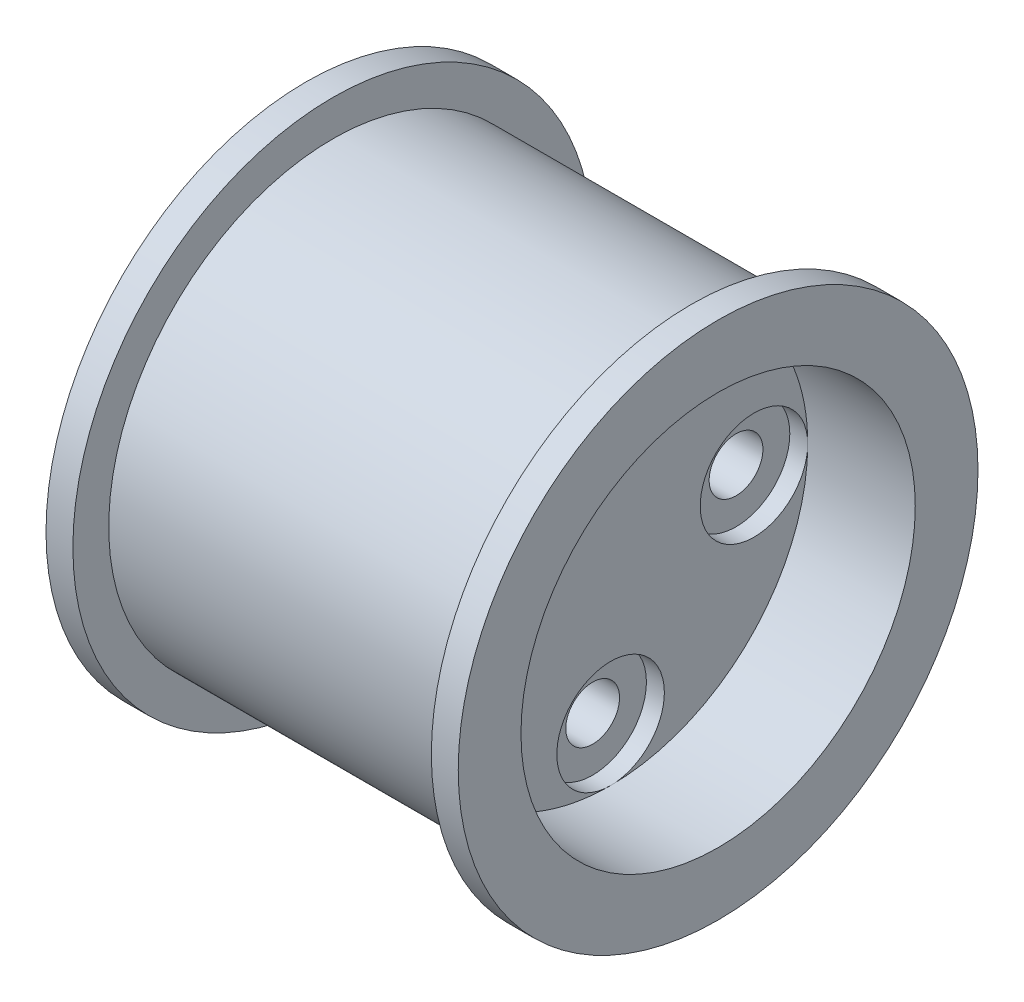
ISO-10303-21;
HEADER;
FILE_DESCRIPTION(('STEP AP214'),'2;1');
FILE_NAME('part.step','',(''),(''),'','','');
FILE_SCHEMA(('AUTOMOTIVE_DESIGN { 1 0 10303 214 1 1 1 1 }'));
ENDSEC;
DATA;
#1=APPLICATION_CONTEXT('core data for automotive mechanical design processes');
#2=APPLICATION_PROTOCOL_DEFINITION('international standard','automotive_design',2000,#1);
#3=PRODUCT_CONTEXT('',#1,'mechanical');
#4=PRODUCT('Part','Part','',(#3));
#5=PRODUCT_RELATED_PRODUCT_CATEGORY('part','',(#4));
#6=PRODUCT_DEFINITION_FORMATION('','',#4);
#7=PRODUCT_DEFINITION_CONTEXT('part definition',#1,'design');
#8=PRODUCT_DEFINITION('design','',#6,#7);
#9=PRODUCT_DEFINITION_SHAPE('','',#8);
#10=(LENGTH_UNIT() NAMED_UNIT(*) SI_UNIT(.MILLI.,.METRE.));
#11=(NAMED_UNIT(*) PLANE_ANGLE_UNIT() SI_UNIT($,.RADIAN.));
#12=(NAMED_UNIT(*) SI_UNIT($,.STERADIAN.) SOLID_ANGLE_UNIT());
#13=UNCERTAINTY_MEASURE_WITH_UNIT(LENGTH_MEASURE(1.E-05),#10,'distance_accuracy_value','');
#14=(GEOMETRIC_REPRESENTATION_CONTEXT(3) GLOBAL_UNCERTAINTY_ASSIGNED_CONTEXT((#13)) GLOBAL_UNIT_ASSIGNED_CONTEXT((#10,
#11,#12)) REPRESENTATION_CONTEXT('',''));
#15=CARTESIAN_POINT('',(0.,0.,0.));
#16=DIRECTION('',(0.,0.,1.));
#17=DIRECTION('',(1.,0.,0.));
#18=AXIS2_PLACEMENT_3D('',#15,#16,#17);
#19=CARTESIAN_POINT('',(-4.24264068711928,0.,8.));
#20=DIRECTION('',(1.,0.,0.));
#21=DIRECTION('',(0.,0.,-1.));
#22=AXIS2_PLACEMENT_3D('',#19,#20,#21);
#23=CYLINDRICAL_SURFACE('',#22,1.5);
#24=CARTESIAN_POINT('',(0.,0.,8.));
#25=DIRECTION('',(1.,0.,0.));
#26=DIRECTION('',(0.,0.,-1.));
#27=AXIS2_PLACEMENT_3D('',#24,#25,#26);
#28=CIRCLE('',#27,1.5);
#29=CARTESIAN_POINT('',(0.,0.,6.5));
#30=VERTEX_POINT('',#29);
#31=EDGE_CURVE('E116',#30,#30,#28,.F.);
#32=ORIENTED_EDGE('',*,*,#31,.T.);
#33=EDGE_LOOP('',(#32));
#34=FACE_BOUND('',#33,.T.);
#35=CARTESIAN_POINT('',(16.,0.,8.));
#36=DIRECTION('',(1.,0.,0.));
#37=DIRECTION('',(0.,0.,-1.));
#38=AXIS2_PLACEMENT_3D('',#35,#36,#37);
#39=CIRCLE('',#38,1.5);
#40=CARTESIAN_POINT('',(16.,0.,6.5));
#41=VERTEX_POINT('',#40);
#42=EDGE_CURVE('E49',#41,#41,#39,.F.);
#43=ORIENTED_EDGE('',*,*,#42,.F.);
#44=EDGE_LOOP('',(#43));
#45=FACE_BOUND('',#44,.T.);
#46=ADVANCED_FACE('F45',(#34,#45),#23,.F.);
#47=CARTESIAN_POINT('',(-4.24264068711928,-8.,0.));
#48=DIRECTION('',(1.,0.,0.));
#49=DIRECTION('',(0.,0.,-1.));
#50=AXIS2_PLACEMENT_3D('',#47,#48,#49);
#51=CYLINDRICAL_SURFACE('',#50,1.5);
#52=CARTESIAN_POINT('',(0.,-8.,0.));
#53=DIRECTION('',(1.,0.,0.));
#54=DIRECTION('',(0.,0.,-1.));
#55=AXIS2_PLACEMENT_3D('',#52,#53,#54);
#56=CIRCLE('',#55,1.5);
#57=CARTESIAN_POINT('',(0.,-8.,-1.5));
#58=VERTEX_POINT('',#57);
#59=EDGE_CURVE('E112',#58,#58,#56,.F.);
#60=ORIENTED_EDGE('',*,*,#59,.T.);
#61=EDGE_LOOP('',(#60));
#62=FACE_BOUND('',#61,.T.);
#63=CARTESIAN_POINT('',(16.,-8.,0.));
#64=DIRECTION('',(1.,0.,0.));
#65=DIRECTION('',(0.,0.,-1.));
#66=AXIS2_PLACEMENT_3D('',#63,#64,#65);
#67=CIRCLE('',#66,1.5);
#68=CARTESIAN_POINT('',(16.,-8.,-1.5));
#69=VERTEX_POINT('',#68);
#70=EDGE_CURVE('E154',#69,#69,#67,.F.);
#71=ORIENTED_EDGE('',*,*,#70,.F.);
#72=EDGE_LOOP('',(#71));
#73=FACE_BOUND('',#72,.T.);
#74=ADVANCED_FACE('F166',(#62,#73),#51,.F.);
#75=CARTESIAN_POINT('',(-4.24264068711928,0.,-8.));
#76=DIRECTION('',(1.,0.,0.));
#77=DIRECTION('',(0.,0.,-1.));
#78=AXIS2_PLACEMENT_3D('',#75,#76,#77);
#79=CYLINDRICAL_SURFACE('',#78,1.5);
#80=CARTESIAN_POINT('',(0.,0.,-8.));
#81=DIRECTION('',(1.,0.,0.));
#82=DIRECTION('',(0.,0.,-1.));
#83=AXIS2_PLACEMENT_3D('',#80,#81,#82);
#84=CIRCLE('',#83,1.5);
#85=CARTESIAN_POINT('',(0.,0.,-9.5));
#86=VERTEX_POINT('',#85);
#87=EDGE_CURVE('E108',#86,#86,#84,.F.);
#88=ORIENTED_EDGE('',*,*,#87,.T.);
#89=EDGE_LOOP('',(#88));
#90=FACE_BOUND('',#89,.T.);
#91=CARTESIAN_POINT('',(16.,0.,-8.));
#92=DIRECTION('',(1.,0.,0.));
#93=DIRECTION('',(0.,0.,-1.));
#94=AXIS2_PLACEMENT_3D('',#91,#92,#93);
#95=CIRCLE('',#94,1.5);
#96=CARTESIAN_POINT('',(16.,0.,-9.5));
#97=VERTEX_POINT('',#96);
#98=EDGE_CURVE('E151',#97,#97,#95,.F.);
#99=ORIENTED_EDGE('',*,*,#98,.F.);
#100=EDGE_LOOP('',(#99));
#101=FACE_BOUND('',#100,.T.);
#102=ADVANCED_FACE('F172',(#90,#101),#79,.F.);
#103=CARTESIAN_POINT('',(-4.24264068711928,8.,0.));
#104=DIRECTION('',(1.,0.,0.));
#105=DIRECTION('',(0.,0.,-1.));
#106=AXIS2_PLACEMENT_3D('',#103,#104,#105);
#107=CYLINDRICAL_SURFACE('',#106,1.5);
#108=CARTESIAN_POINT('',(0.,8.,0.));
#109=DIRECTION('',(1.,0.,0.));
#110=DIRECTION('',(0.,0.,-1.));
#111=AXIS2_PLACEMENT_3D('',#108,#109,#110);
#112=CIRCLE('',#111,1.5);
#113=CARTESIAN_POINT('',(0.,8.,-1.5));
#114=VERTEX_POINT('',#113);
#115=EDGE_CURVE('E103',#114,#114,#112,.F.);
#116=ORIENTED_EDGE('',*,*,#115,.T.);
#117=EDGE_LOOP('',(#116));
#118=FACE_BOUND('',#117,.T.);
#119=CARTESIAN_POINT('',(16.,8.,0.));
#120=DIRECTION('',(1.,0.,0.));
#121=DIRECTION('',(0.,0.,-1.));
#122=AXIS2_PLACEMENT_3D('',#119,#120,#121);
#123=CIRCLE('',#122,1.5);
#124=CARTESIAN_POINT('',(16.,8.,-1.5));
#125=VERTEX_POINT('',#124);
#126=EDGE_CURVE('E147',#125,#125,#123,.F.);
#127=ORIENTED_EDGE('',*,*,#126,.F.);
#128=EDGE_LOOP('',(#127));
#129=FACE_BOUND('',#128,.T.);
#130=ADVANCED_FACE('F220',(#118,#129),#107,.F.);
#131=CARTESIAN_POINT('',(1.5,0.,0.));
#132=DIRECTION('',(-1.,0.,0.));
#133=DIRECTION('',(0.,0.,1.));
#134=AXIS2_PLACEMENT_3D('',#131,#132,#133);
#135=CYLINDRICAL_SURFACE('',#134,14.5);
#136=CARTESIAN_POINT('',(1.5,0.,0.));
#137=DIRECTION('',(1.,0.,0.));
#138=DIRECTION('',(0.,0.,-1.));
#139=AXIS2_PLACEMENT_3D('',#136,#137,#138);
#140=CIRCLE('',#139,14.5);
#141=CARTESIAN_POINT('',(1.5,0.,-14.5));
#142=VERTEX_POINT('',#141);
#143=EDGE_CURVE('E55',#142,#142,#140,.T.);
#144=ORIENTED_EDGE('',*,*,#143,.F.);
#145=EDGE_LOOP('',(#144));
#146=FACE_BOUND('',#145,.T.);
#147=CARTESIAN_POINT('',(0.,0.,0.));
#148=DIRECTION('',(1.,0.,0.));
#149=DIRECTION('',(0.,0.,-1.));
#150=AXIS2_PLACEMENT_3D('',#147,#148,#149);
#151=CIRCLE('',#150,14.5);
#152=CARTESIAN_POINT('',(0.,0.,-14.5));
#153=VERTEX_POINT('',#152);
#154=EDGE_CURVE('E139',#153,#153,#151,.T.);
#155=ORIENTED_EDGE('',*,*,#154,.T.);
#156=EDGE_LOOP('',(#155));
#157=FACE_BOUND('',#156,.T.);
#158=ADVANCED_FACE('F47',(#146,#157),#135,.T.);
#159=CARTESIAN_POINT('',(1.5,0.,0.));
#160=DIRECTION('',(1.,0.,0.));
#161=DIRECTION('',(0.,0.,-1.));
#162=AXIS2_PLACEMENT_3D('',#159,#160,#161);
#163=PLANE('',#162);
#164=CARTESIAN_POINT('',(1.5,0.,0.));
#165=DIRECTION('',(1.,0.,0.));
#166=DIRECTION('',(0.,0.,-1.));
#167=AXIS2_PLACEMENT_3D('',#164,#165,#166);
#168=CIRCLE('',#167,12.5);
#169=CARTESIAN_POINT('',(1.5,0.,-12.5));
#170=VERTEX_POINT('',#169);
#171=EDGE_CURVE('E11',#170,#170,#168,.T.);
#172=ORIENTED_EDGE('',*,*,#171,.F.);
#173=EDGE_LOOP('',(#172));
#174=FACE_BOUND('',#173,.T.);
#175=ORIENTED_EDGE('',*,*,#143,.T.);
#176=EDGE_LOOP('',(#175));
#177=FACE_BOUND('',#176,.T.);
#178=ADVANCED_FACE('F202',(#174,#177),#163,.T.);
#179=CARTESIAN_POINT('',(0.,0.,0.));
#180=DIRECTION('',(1.,0.,0.));
#181=DIRECTION('',(0.,0.,-1.));
#182=AXIS2_PLACEMENT_3D('',#179,#180,#181);
#183=PLANE('',#182);
#184=ORIENTED_EDGE('',*,*,#115,.F.);
#185=EDGE_LOOP('',(#184));
#186=FACE_BOUND('',#185,.T.);
#187=ORIENTED_EDGE('',*,*,#87,.F.);
#188=EDGE_LOOP('',(#187));
#189=FACE_BOUND('',#188,.T.);
#190=ORIENTED_EDGE('',*,*,#59,.F.);
#191=EDGE_LOOP('',(#190));
#192=FACE_BOUND('',#191,.T.);
#193=ORIENTED_EDGE('',*,*,#31,.F.);
#194=EDGE_LOOP('',(#193));
#195=FACE_BOUND('',#194,.T.);
#196=ORIENTED_EDGE('',*,*,#154,.F.);
#197=EDGE_LOOP('',(#196));
#198=FACE_BOUND('',#197,.T.);
#199=ADVANCED_FACE('F200',(#186,#189,#192,#195,#198),#183,.F.);
#200=CARTESIAN_POINT('',(21.5,0.,0.));
#201=DIRECTION('',(-1.,0.,0.));
#202=DIRECTION('',(0.,0.,1.));
#203=AXIS2_PLACEMENT_3D('',#200,#201,#202);
#204=CYLINDRICAL_SURFACE('',#203,12.5);
#205=CARTESIAN_POINT('',(21.5,0.,0.));
#206=DIRECTION('',(1.,0.,0.));
#207=DIRECTION('',(0.,0.,-1.));
#208=AXIS2_PLACEMENT_3D('',#205,#206,#207);
#209=CIRCLE('',#208,12.5);
#210=CARTESIAN_POINT('',(21.5,0.,-12.5));
#211=VERTEX_POINT('',#210);
#212=EDGE_CURVE('E133',#211,#211,#209,.T.);
#213=ORIENTED_EDGE('',*,*,#212,.F.);
#214=EDGE_LOOP('',(#213));
#215=FACE_BOUND('',#214,.T.);
#216=ORIENTED_EDGE('',*,*,#171,.T.);
#217=EDGE_LOOP('',(#216));
#218=FACE_BOUND('',#217,.T.);
#219=ADVANCED_FACE('F196',(#215,#218),#204,.T.);
#220=CARTESIAN_POINT('',(23.,0.,0.));
#221=DIRECTION('',(-1.,0.,0.));
#222=DIRECTION('',(0.,0.,1.));
#223=AXIS2_PLACEMENT_3D('',#220,#221,#222);
#224=CYLINDRICAL_SURFACE('',#223,14.5);
#225=CARTESIAN_POINT('',(23.,0.,0.));
#226=DIRECTION('',(1.,0.,0.));
#227=DIRECTION('',(0.,0.,-1.));
#228=AXIS2_PLACEMENT_3D('',#225,#226,#227);
#229=CIRCLE('',#228,14.5);
#230=CARTESIAN_POINT('',(23.,0.,-14.5));
#231=VERTEX_POINT('',#230);
#232=EDGE_CURVE('E129',#231,#231,#229,.T.);
#233=ORIENTED_EDGE('',*,*,#232,.F.);
#234=EDGE_LOOP('',(#233));
#235=FACE_BOUND('',#234,.T.);
#236=CARTESIAN_POINT('',(21.5,0.,0.));
#237=DIRECTION('',(1.,0.,0.));
#238=DIRECTION('',(0.,0.,-1.));
#239=AXIS2_PLACEMENT_3D('',#236,#237,#238);
#240=CIRCLE('',#239,14.5);
#241=CARTESIAN_POINT('',(21.5,0.,-14.5));
#242=VERTEX_POINT('',#241);
#243=EDGE_CURVE('E123',#242,#242,#240,.T.);
#244=ORIENTED_EDGE('',*,*,#243,.T.);
#245=EDGE_LOOP('',(#244));
#246=FACE_BOUND('',#245,.T.);
#247=ADVANCED_FACE('F189',(#235,#246),#224,.T.);
#248=CARTESIAN_POINT('',(23.,0.,0.));
#249=DIRECTION('',(1.,0.,0.));
#250=DIRECTION('',(0.,0.,-1.));
#251=AXIS2_PLACEMENT_3D('',#248,#249,#250);
#252=PLANE('',#251);
#253=CARTESIAN_POINT('',(23.,0.,0.));
#254=DIRECTION('',(1.,0.,0.));
#255=DIRECTION('',(0.,0.,-1.));
#256=AXIS2_PLACEMENT_3D('',#253,#254,#255);
#257=CIRCLE('',#256,11.);
#258=CARTESIAN_POINT('',(23.,0.,-11.));
#259=VERTEX_POINT('',#258);
#260=EDGE_CURVE('E107',#259,#259,#257,.T.);
#261=ORIENTED_EDGE('',*,*,#260,.F.);
#262=EDGE_LOOP('',(#261));
#263=FACE_BOUND('',#262,.T.);
#264=ORIENTED_EDGE('',*,*,#232,.T.);
#265=EDGE_LOOP('',(#264));
#266=FACE_BOUND('',#265,.T.);
#267=ADVANCED_FACE('F186',(#263,#266),#252,.T.);
#268=CARTESIAN_POINT('',(21.5,0.,0.));
#269=DIRECTION('',(1.,0.,0.));
#270=DIRECTION('',(0.,0.,-1.));
#271=AXIS2_PLACEMENT_3D('',#268,#269,#270);
#272=PLANE('',#271);
#273=ORIENTED_EDGE('',*,*,#212,.T.);
#274=EDGE_LOOP('',(#273));
#275=FACE_BOUND('',#274,.T.);
#276=ORIENTED_EDGE('',*,*,#243,.F.);
#277=EDGE_LOOP('',(#276));
#278=FACE_BOUND('',#277,.T.);
#279=ADVANCED_FACE('F184',(#275,#278),#272,.F.);
#280=CARTESIAN_POINT('',(17.,0.,0.));
#281=DIRECTION('',(1.,0.,0.));
#282=DIRECTION('',(0.,0.,-1.));
#283=AXIS2_PLACEMENT_3D('',#280,#281,#282);
#284=CYLINDRICAL_SURFACE('',#283,11.);
#285=CARTESIAN_POINT('',(17.,0.,0.));
#286=DIRECTION('',(1.,0.,0.));
#287=DIRECTION('',(0.,0.,-1.));
#288=AXIS2_PLACEMENT_3D('',#285,#286,#287);
#289=CIRCLE('',#288,11.);
#290=CARTESIAN_POINT('',(17.,0.,-11.));
#291=VERTEX_POINT('',#290);
#292=CARTESIAN_POINT('',(17.,11.,0.));
#293=VERTEX_POINT('',#292);
#294=EDGE_CURVE('E120',#291,#293,#289,.T.);
#295=ORIENTED_EDGE('',*,*,#294,.F.);
#296=CARTESIAN_POINT('',(17.,-11.,0.));
#297=VERTEX_POINT('',#296);
#298=EDGE_CURVE('E125',#297,#291,#289,.T.);
#299=ORIENTED_EDGE('',*,*,#298,.F.);
#300=CARTESIAN_POINT('',(17.,0.,11.));
#301=VERTEX_POINT('',#300);
#302=EDGE_CURVE('E279',#301,#297,#289,.T.);
#303=ORIENTED_EDGE('',*,*,#302,.F.);
#304=EDGE_CURVE('E124',#293,#301,#289,.T.);
#305=ORIENTED_EDGE('',*,*,#304,.F.);
#306=EDGE_LOOP('',(#295,#299,#303,#305));
#307=FACE_BOUND('',#306,.T.);
#308=ORIENTED_EDGE('',*,*,#260,.T.);
#309=EDGE_LOOP('',(#308));
#310=FACE_BOUND('',#309,.T.);
#311=ADVANCED_FACE('F181',(#307,#310),#284,.F.);
#312=CARTESIAN_POINT('',(17.,0.,0.));
#313=DIRECTION('',(1.,0.,0.));
#314=DIRECTION('',(0.,0.,-1.));
#315=AXIS2_PLACEMENT_3D('',#312,#313,#314);
#316=PLANE('',#315);
#317=ORIENTED_EDGE('',*,*,#294,.T.);
#318=CARTESIAN_POINT('',(17.,8.,0.));
#319=DIRECTION('',(1.,0.,0.));
#320=DIRECTION('',(0.,0.,-1.));
#321=AXIS2_PLACEMENT_3D('',#318,#319,#320);
#322=CIRCLE('',#321,3.);
#323=EDGE_CURVE('E80',#293,#293,#322,.T.);
#324=ORIENTED_EDGE('',*,*,#323,.F.);
#325=ORIENTED_EDGE('',*,*,#304,.T.);
#326=CARTESIAN_POINT('',(17.,0.,8.));
#327=DIRECTION('',(1.,0.,0.));
#328=DIRECTION('',(0.,0.,-1.));
#329=AXIS2_PLACEMENT_3D('',#326,#327,#328);
#330=CIRCLE('',#329,3.);
#331=EDGE_CURVE('E66',#301,#301,#330,.T.);
#332=ORIENTED_EDGE('',*,*,#331,.F.);
#333=ORIENTED_EDGE('',*,*,#302,.T.);
#334=CARTESIAN_POINT('',(17.,-8.,0.));
#335=DIRECTION('',(1.,0.,0.));
#336=DIRECTION('',(0.,0.,-1.));
#337=AXIS2_PLACEMENT_3D('',#334,#335,#336);
#338=CIRCLE('',#337,3.);
#339=EDGE_CURVE('E61',#297,#297,#338,.T.);
#340=ORIENTED_EDGE('',*,*,#339,.F.);
#341=ORIENTED_EDGE('',*,*,#298,.T.);
#342=CARTESIAN_POINT('',(17.,0.,-8.));
#343=DIRECTION('',(1.,0.,0.));
#344=DIRECTION('',(0.,0.,-1.));
#345=AXIS2_PLACEMENT_3D('',#342,#343,#344);
#346=CIRCLE('',#345,3.);
#347=EDGE_CURVE('E74',#291,#291,#346,.T.);
#348=ORIENTED_EDGE('',*,*,#347,.F.);
#349=EDGE_LOOP('',(#317,#324,#325,#332,#333,#340,#341,#348));
#350=FACE_BOUND('',#349,.T.);
#351=ADVANCED_FACE('F177',(#350),#316,.T.);
#352=CARTESIAN_POINT('',(16.,8.,0.));
#353=DIRECTION('',(1.,0.,0.));
#354=DIRECTION('',(0.,0.,-1.));
#355=AXIS2_PLACEMENT_3D('',#352,#353,#354);
#356=PLANE('',#355);
#357=CARTESIAN_POINT('',(16.,8.,0.));
#358=DIRECTION('',(1.,0.,0.));
#359=DIRECTION('',(0.,0.,-1.));
#360=AXIS2_PLACEMENT_3D('',#357,#358,#359);
#361=CIRCLE('',#360,3.);
#362=CARTESIAN_POINT('',(16.,8.,-3.));
#363=VERTEX_POINT('',#362);
#364=EDGE_CURVE('E85',#363,#363,#361,.T.);
#365=ORIENTED_EDGE('',*,*,#364,.T.);
#366=EDGE_LOOP('',(#365));
#367=FACE_BOUND('',#366,.T.);
#368=ORIENTED_EDGE('',*,*,#126,.T.);
#369=EDGE_LOOP('',(#368));
#370=FACE_BOUND('',#369,.T.);
#371=ADVANCED_FACE('F180',(#367,#370),#356,.T.);
#372=CARTESIAN_POINT('',(16.,8.,0.));
#373=DIRECTION('',(1.,0.,0.));
#374=DIRECTION('',(0.,0.,-1.));
#375=AXIS2_PLACEMENT_3D('',#372,#373,#374);
#376=CYLINDRICAL_SURFACE('',#375,3.);
#377=ORIENTED_EDGE('',*,*,#364,.F.);
#378=EDGE_LOOP('',(#377));
#379=FACE_BOUND('',#378,.T.);
#380=ORIENTED_EDGE('',*,*,#323,.T.);
#381=EDGE_LOOP('',(#380));
#382=FACE_BOUND('',#381,.T.);
#383=ADVANCED_FACE('F253',(#379,#382),#376,.F.);
#384=CARTESIAN_POINT('',(16.,0.,-8.));
#385=DIRECTION('',(1.,0.,0.));
#386=DIRECTION('',(0.,0.,-1.));
#387=AXIS2_PLACEMENT_3D('',#384,#385,#386);
#388=PLANE('',#387);
#389=CARTESIAN_POINT('',(16.,0.,-8.));
#390=DIRECTION('',(1.,0.,0.));
#391=DIRECTION('',(0.,0.,-1.));
#392=AXIS2_PLACEMENT_3D('',#389,#390,#391);
#393=CIRCLE('',#392,3.);
#394=CARTESIAN_POINT('',(16.,0.,-11.));
#395=VERTEX_POINT('',#394);
#396=EDGE_CURVE('E81',#395,#395,#393,.T.);
#397=ORIENTED_EDGE('',*,*,#396,.T.);
#398=EDGE_LOOP('',(#397));
#399=FACE_BOUND('',#398,.T.);
#400=ORIENTED_EDGE('',*,*,#98,.T.);
#401=EDGE_LOOP('',(#400));
#402=FACE_BOUND('',#401,.T.);
#403=ADVANCED_FACE('F250',(#399,#402),#388,.T.);
#404=CARTESIAN_POINT('',(16.,0.,-8.));
#405=DIRECTION('',(1.,0.,0.));
#406=DIRECTION('',(0.,0.,-1.));
#407=AXIS2_PLACEMENT_3D('',#404,#405,#406);
#408=CYLINDRICAL_SURFACE('',#407,3.);
#409=ORIENTED_EDGE('',*,*,#396,.F.);
#410=EDGE_LOOP('',(#409));
#411=FACE_BOUND('',#410,.T.);
#412=ORIENTED_EDGE('',*,*,#347,.T.);
#413=EDGE_LOOP('',(#412));
#414=FACE_BOUND('',#413,.T.);
#415=ADVANCED_FACE('F75',(#411,#414),#408,.F.);
#416=CARTESIAN_POINT('',(16.,-8.,0.));
#417=DIRECTION('',(1.,0.,0.));
#418=DIRECTION('',(0.,0.,-1.));
#419=AXIS2_PLACEMENT_3D('',#416,#417,#418);
#420=PLANE('',#419);
#421=CARTESIAN_POINT('',(16.,-8.,0.));
#422=DIRECTION('',(1.,0.,0.));
#423=DIRECTION('',(0.,0.,-1.));
#424=AXIS2_PLACEMENT_3D('',#421,#422,#423);
#425=CIRCLE('',#424,3.);
#426=CARTESIAN_POINT('',(16.,-8.,-3.));
#427=VERTEX_POINT('',#426);
#428=EDGE_CURVE('E93',#427,#427,#425,.T.);
#429=ORIENTED_EDGE('',*,*,#428,.T.);
#430=EDGE_LOOP('',(#429));
#431=FACE_BOUND('',#430,.T.);
#432=ORIENTED_EDGE('',*,*,#70,.T.);
#433=EDGE_LOOP('',(#432));
#434=FACE_BOUND('',#433,.T.);
#435=ADVANCED_FACE('F243',(#431,#434),#420,.T.);
#436=CARTESIAN_POINT('',(16.,-8.,0.));
#437=DIRECTION('',(1.,0.,0.));
#438=DIRECTION('',(0.,0.,-1.));
#439=AXIS2_PLACEMENT_3D('',#436,#437,#438);
#440=CYLINDRICAL_SURFACE('',#439,3.);
#441=ORIENTED_EDGE('',*,*,#428,.F.);
#442=EDGE_LOOP('',(#441));
#443=FACE_BOUND('',#442,.T.);
#444=ORIENTED_EDGE('',*,*,#339,.T.);
#445=EDGE_LOOP('',(#444));
#446=FACE_BOUND('',#445,.T.);
#447=ADVANCED_FACE('F238',(#443,#446),#440,.F.);
#448=CARTESIAN_POINT('',(16.,0.,8.));
#449=DIRECTION('',(1.,0.,0.));
#450=DIRECTION('',(0.,0.,-1.));
#451=AXIS2_PLACEMENT_3D('',#448,#449,#450);
#452=PLANE('',#451);
#453=CARTESIAN_POINT('',(16.,0.,8.));
#454=DIRECTION('',(1.,0.,0.));
#455=DIRECTION('',(0.,0.,-1.));
#456=AXIS2_PLACEMENT_3D('',#453,#454,#455);
#457=CIRCLE('',#456,3.);
#458=CARTESIAN_POINT('',(16.,0.,5.));
#459=VERTEX_POINT('',#458);
#460=EDGE_CURVE('E99',#459,#459,#457,.T.);
#461=ORIENTED_EDGE('',*,*,#460,.T.);
#462=EDGE_LOOP('',(#461));
#463=FACE_BOUND('',#462,.T.);
#464=ORIENTED_EDGE('',*,*,#42,.T.);
#465=EDGE_LOOP('',(#464));
#466=FACE_BOUND('',#465,.T.);
#467=ADVANCED_FACE('F163',(#463,#466),#452,.T.);
#468=CARTESIAN_POINT('',(16.,0.,8.));
#469=DIRECTION('',(1.,0.,0.));
#470=DIRECTION('',(0.,0.,-1.));
#471=AXIS2_PLACEMENT_3D('',#468,#469,#470);
#472=CYLINDRICAL_SURFACE('',#471,3.);
#473=ORIENTED_EDGE('',*,*,#460,.F.);
#474=EDGE_LOOP('',(#473));
#475=FACE_BOUND('',#474,.T.);
#476=ORIENTED_EDGE('',*,*,#331,.T.);
#477=EDGE_LOOP('',(#476));
#478=FACE_BOUND('',#477,.T.);
#479=ADVANCED_FACE('F237',(#475,#478),#472,.F.);
#480=CLOSED_SHELL('',(#46,#74,#102,#130,#158,#178,#199,#219,#247,#267,#279,#311,#351,#371,#383,
#403,#415,#435,#447,#467,#479));
#481=MANIFOLD_SOLID_BREP('B2',#480);
#482=ADVANCED_BREP_SHAPE_REPRESENTATION('',(#18,#481),#14);
#483=SHAPE_DEFINITION_REPRESENTATION(#9,#482);
ENDSEC;
END-ISO-10303-21;
